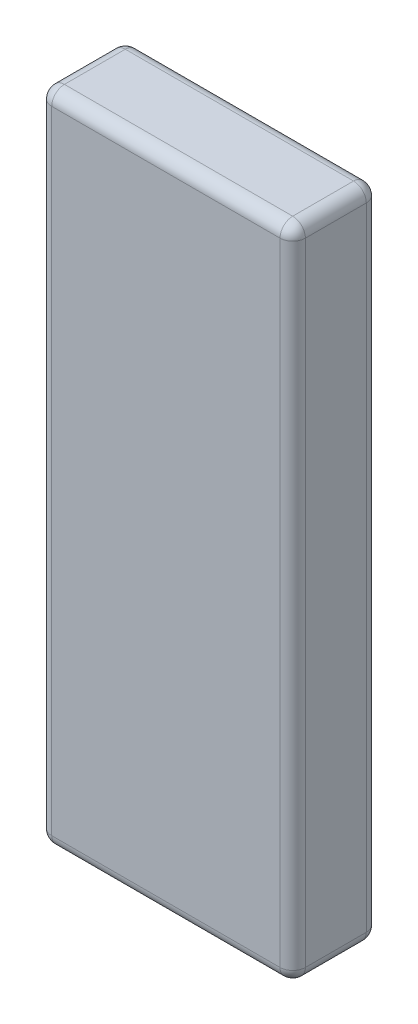
ISO-10303-21;
HEADER;
FILE_DESCRIPTION(('STEP AP214'),'2;1');
FILE_NAME('part.step','',(''),(''),'','','');
FILE_SCHEMA(('AUTOMOTIVE_DESIGN { 1 0 10303 214 1 1 1 1 }'));
ENDSEC;
DATA;
#1=APPLICATION_CONTEXT('core data for automotive mechanical design processes');
#2=APPLICATION_PROTOCOL_DEFINITION('international standard','automotive_design',2000,#1);
#3=PRODUCT_CONTEXT('',#1,'mechanical');
#4=PRODUCT('Part','Part','',(#3));
#5=PRODUCT_RELATED_PRODUCT_CATEGORY('part','',(#4));
#6=PRODUCT_DEFINITION_FORMATION('','',#4);
#7=PRODUCT_DEFINITION_CONTEXT('part definition',#1,'design');
#8=PRODUCT_DEFINITION('design','',#6,#7);
#9=PRODUCT_DEFINITION_SHAPE('','',#8);
#10=(LENGTH_UNIT() NAMED_UNIT(*) SI_UNIT(.MILLI.,.METRE.));
#11=(NAMED_UNIT(*) PLANE_ANGLE_UNIT() SI_UNIT($,.RADIAN.));
#12=(NAMED_UNIT(*) SI_UNIT($,.STERADIAN.) SOLID_ANGLE_UNIT());
#13=UNCERTAINTY_MEASURE_WITH_UNIT(LENGTH_MEASURE(1.E-05),#10,'distance_accuracy_value','');
#14=(GEOMETRIC_REPRESENTATION_CONTEXT(3) GLOBAL_UNCERTAINTY_ASSIGNED_CONTEXT((#13)) GLOBAL_UNIT_ASSIGNED_CONTEXT((#10,
#11,#12)) REPRESENTATION_CONTEXT('',''));
#15=CARTESIAN_POINT('',(0.,0.,0.));
#16=DIRECTION('',(0.,0.,1.));
#17=DIRECTION('',(1.,0.,0.));
#18=AXIS2_PLACEMENT_3D('',#15,#16,#17);
#19=CARTESIAN_POINT('',(0.,0.,6.8));
#20=DIRECTION('',(1.,0.,0.));
#21=DIRECTION('',(0.,0.,-1.));
#22=AXIS2_PLACEMENT_3D('',#19,#20,#21);
#23=PLANE('',#22);
#24=DIRECTION('',(0.,0.,-1.));
#25=VECTOR('',#24,1.);
#26=CARTESIAN_POINT('',(0.,50.8,6.8));
#27=LINE('',#26,#25);
#28=CARTESIAN_POINT('',(0.,50.8,5.8));
#29=VERTEX_POINT('',#28);
#30=CARTESIAN_POINT('',(0.,50.8,1.));
#31=VERTEX_POINT('',#30);
#32=EDGE_CURVE('E187',#29,#31,#27,.T.);
#33=ORIENTED_EDGE('',*,*,#32,.T.);
#34=DIRECTION('',(0.,-1.,0.));
#35=VECTOR('',#34,1.);
#36=CARTESIAN_POINT('',(0.,0.,1.));
#37=LINE('',#36,#35);
#38=CARTESIAN_POINT('',(0.,1.,1.));
#39=VERTEX_POINT('',#38);
#40=EDGE_CURVE('E194',#31,#39,#37,.T.);
#41=ORIENTED_EDGE('',*,*,#40,.T.);
#42=DIRECTION('',(0.,0.,-1.));
#43=VECTOR('',#42,1.);
#44=CARTESIAN_POINT('',(0.,1.,6.8));
#45=LINE('',#44,#43);
#46=CARTESIAN_POINT('',(0.,1.,5.8));
#47=VERTEX_POINT('',#46);
#48=EDGE_CURVE('E190',#39,#47,#45,.F.);
#49=ORIENTED_EDGE('',*,*,#48,.T.);
#50=DIRECTION('',(0.,-1.,0.));
#51=VECTOR('',#50,1.);
#52=CARTESIAN_POINT('',(0.,0.,5.8));
#53=LINE('',#52,#51);
#54=EDGE_CURVE('E184',#47,#29,#53,.F.);
#55=ORIENTED_EDGE('',*,*,#54,.T.);
#56=EDGE_LOOP('',(#33,#41,#49,#55));
#57=FACE_BOUND('',#56,.T.);
#58=ADVANCED_FACE('F45',(#57),#23,.F.);
#59=CARTESIAN_POINT('',(0.,0.,6.8));
#60=DIRECTION('',(0.,1.,0.));
#61=DIRECTION('',(0.,0.,1.));
#62=AXIS2_PLACEMENT_3D('',#59,#60,#61);
#63=PLANE('',#62);
#64=DIRECTION('',(0.,0.,-1.));
#65=VECTOR('',#64,1.);
#66=CARTESIAN_POINT('',(1.,0.,6.8));
#67=LINE('',#66,#65);
#68=CARTESIAN_POINT('',(1.,0.,5.8));
#69=VERTEX_POINT('',#68);
#70=CARTESIAN_POINT('',(1.,0.,1.));
#71=VERTEX_POINT('',#70);
#72=EDGE_CURVE('E146',#69,#71,#67,.T.);
#73=ORIENTED_EDGE('',*,*,#72,.T.);
#74=DIRECTION('',(1.,0.,0.));
#75=VECTOR('',#74,1.);
#76=CARTESIAN_POINT('',(20.,0.,1.));
#77=LINE('',#76,#75);
#78=CARTESIAN_POINT('',(19.,0.,1.));
#79=VERTEX_POINT('',#78);
#80=EDGE_CURVE('E141',#71,#79,#77,.T.);
#81=ORIENTED_EDGE('',*,*,#80,.T.);
#82=DIRECTION('',(0.,0.,-1.));
#83=VECTOR('',#82,1.);
#84=CARTESIAN_POINT('',(19.,0.,6.8));
#85=LINE('',#84,#83);
#86=CARTESIAN_POINT('',(19.,0.,5.8));
#87=VERTEX_POINT('',#86);
#88=EDGE_CURVE('E133',#79,#87,#85,.F.);
#89=ORIENTED_EDGE('',*,*,#88,.T.);
#90=DIRECTION('',(1.,0.,0.));
#91=VECTOR('',#90,1.);
#92=CARTESIAN_POINT('',(0.,0.,5.8));
#93=LINE('',#92,#91);
#94=EDGE_CURVE('E138',#87,#69,#93,.F.);
#95=ORIENTED_EDGE('',*,*,#94,.T.);
#96=EDGE_LOOP('',(#73,#81,#89,#95));
#97=FACE_BOUND('',#96,.T.);
#98=ADVANCED_FACE('F136',(#97),#63,.F.);
#99=CARTESIAN_POINT('',(20.,0.,6.8));
#100=DIRECTION('',(-1.,0.,0.));
#101=DIRECTION('',(0.,-1.,0.));
#102=AXIS2_PLACEMENT_3D('',#99,#100,#101);
#103=PLANE('',#102);
#104=DIRECTION('',(0.,0.,-1.));
#105=VECTOR('',#104,1.);
#106=CARTESIAN_POINT('',(20.,1.,6.8));
#107=LINE('',#106,#105);
#108=CARTESIAN_POINT('',(20.,1.,5.8));
#109=VERTEX_POINT('',#108);
#110=CARTESIAN_POINT('',(20.,1.,1.));
#111=VERTEX_POINT('',#110);
#112=EDGE_CURVE('E154',#109,#111,#107,.T.);
#113=ORIENTED_EDGE('',*,*,#112,.T.);
#114=DIRECTION('',(0.,1.,0.));
#115=VECTOR('',#114,1.);
#116=CARTESIAN_POINT('',(20.,51.8,1.));
#117=LINE('',#116,#115);
#118=CARTESIAN_POINT('',(20.,50.8,1.));
#119=VERTEX_POINT('',#118);
#120=EDGE_CURVE('E205',#111,#119,#117,.T.);
#121=ORIENTED_EDGE('',*,*,#120,.T.);
#122=DIRECTION('',(0.,0.,-1.));
#123=VECTOR('',#122,1.);
#124=CARTESIAN_POINT('',(20.,50.8,6.8));
#125=LINE('',#124,#123);
#126=CARTESIAN_POINT('',(20.,50.8,5.8));
#127=VERTEX_POINT('',#126);
#128=EDGE_CURVE('E200',#119,#127,#125,.F.);
#129=ORIENTED_EDGE('',*,*,#128,.T.);
#130=DIRECTION('',(0.,1.,0.));
#131=VECTOR('',#130,1.);
#132=CARTESIAN_POINT('',(20.,0.,5.8));
#133=LINE('',#132,#131);
#134=EDGE_CURVE('E197',#127,#109,#133,.F.);
#135=ORIENTED_EDGE('',*,*,#134,.T.);
#136=EDGE_LOOP('',(#113,#121,#129,#135));
#137=FACE_BOUND('',#136,.T.);
#138=ADVANCED_FACE('F384',(#137),#103,.F.);
#139=CARTESIAN_POINT('',(0.,51.8,6.8));
#140=DIRECTION('',(0.,-1.,0.));
#141=DIRECTION('',(0.,0.,-1.));
#142=AXIS2_PLACEMENT_3D('',#139,#140,#141);
#143=PLANE('',#142);
#144=DIRECTION('',(0.,0.,-1.));
#145=VECTOR('',#144,1.);
#146=CARTESIAN_POINT('',(19.,51.8,6.8));
#147=LINE('',#146,#145);
#148=CARTESIAN_POINT('',(19.,51.8,5.8));
#149=VERTEX_POINT('',#148);
#150=CARTESIAN_POINT('',(19.,51.8,1.));
#151=VERTEX_POINT('',#150);
#152=EDGE_CURVE('E214',#149,#151,#147,.T.);
#153=ORIENTED_EDGE('',*,*,#152,.T.);
#154=DIRECTION('',(-1.,0.,0.));
#155=VECTOR('',#154,1.);
#156=CARTESIAN_POINT('',(0.,51.8,1.));
#157=LINE('',#156,#155);
#158=CARTESIAN_POINT('',(1.,51.8,1.));
#159=VERTEX_POINT('',#158);
#160=EDGE_CURVE('E218',#151,#159,#157,.T.);
#161=ORIENTED_EDGE('',*,*,#160,.T.);
#162=DIRECTION('',(0.,0.,-1.));
#163=VECTOR('',#162,1.);
#164=CARTESIAN_POINT('',(1.,51.8,6.8));
#165=LINE('',#164,#163);
#166=CARTESIAN_POINT('',(1.,51.8,5.8));
#167=VERTEX_POINT('',#166);
#168=EDGE_CURVE('E211',#159,#167,#165,.F.);
#169=ORIENTED_EDGE('',*,*,#168,.T.);
#170=DIRECTION('',(-1.,0.,0.));
#171=VECTOR('',#170,1.);
#172=CARTESIAN_POINT('',(0.,51.8,5.8));
#173=LINE('',#172,#171);
#174=EDGE_CURVE('E208',#167,#149,#173,.F.);
#175=ORIENTED_EDGE('',*,*,#174,.T.);
#176=EDGE_LOOP('',(#153,#161,#169,#175));
#177=FACE_BOUND('',#176,.T.);
#178=ADVANCED_FACE('F333',(#177),#143,.F.);
#179=CARTESIAN_POINT('',(0.,0.,6.8));
#180=DIRECTION('',(0.,0.,-1.));
#181=DIRECTION('',(-1.,0.,0.));
#182=AXIS2_PLACEMENT_3D('',#179,#180,#181);
#183=PLANE('',#182);
#184=DIRECTION('',(0.,1.,0.));
#185=VECTOR('',#184,1.);
#186=CARTESIAN_POINT('',(19.,0.,6.8));
#187=LINE('',#186,#185);
#188=CARTESIAN_POINT('',(19.,1.,6.8));
#189=VERTEX_POINT('',#188);
#190=CARTESIAN_POINT('',(19.,50.8,6.8));
#191=VERTEX_POINT('',#190);
#192=EDGE_CURVE('E55',#189,#191,#187,.T.);
#193=ORIENTED_EDGE('',*,*,#192,.T.);
#194=DIRECTION('',(-1.,0.,0.));
#195=VECTOR('',#194,1.);
#196=CARTESIAN_POINT('',(0.,50.8,6.8));
#197=LINE('',#196,#195);
#198=CARTESIAN_POINT('',(1.,50.8,6.8));
#199=VERTEX_POINT('',#198);
#200=EDGE_CURVE('E11',#191,#199,#197,.T.);
#201=ORIENTED_EDGE('',*,*,#200,.T.);
#202=DIRECTION('',(0.,-1.,0.));
#203=VECTOR('',#202,1.);
#204=CARTESIAN_POINT('',(1.,0.,6.8));
#205=LINE('',#204,#203);
#206=CARTESIAN_POINT('',(1.,1.,6.8));
#207=VERTEX_POINT('',#206);
#208=EDGE_CURVE('E234',#199,#207,#205,.T.);
#209=ORIENTED_EDGE('',*,*,#208,.T.);
#210=DIRECTION('',(1.,0.,0.));
#211=VECTOR('',#210,1.);
#212=CARTESIAN_POINT('',(0.,1.,6.8));
#213=LINE('',#212,#211);
#214=EDGE_CURVE('E66',#207,#189,#213,.T.);
#215=ORIENTED_EDGE('',*,*,#214,.T.);
#216=EDGE_LOOP('',(#193,#201,#209,#215));
#217=FACE_BOUND('',#216,.T.);
#218=ADVANCED_FACE('F348',(#217),#183,.F.);
#219=CARTESIAN_POINT('',(0.,0.,0.));
#220=DIRECTION('',(0.,0.,-1.));
#221=DIRECTION('',(-1.,0.,0.));
#222=AXIS2_PLACEMENT_3D('',#219,#220,#221);
#223=PLANE('',#222);
#224=DIRECTION('',(0.,1.,0.));
#225=VECTOR('',#224,1.);
#226=CARTESIAN_POINT('',(19.,0.,0.));
#227=LINE('',#226,#225);
#228=CARTESIAN_POINT('',(19.,50.8,0.));
#229=VERTEX_POINT('',#228);
#230=CARTESIAN_POINT('',(19.,1.,0.));
#231=VERTEX_POINT('',#230);
#232=EDGE_CURVE('E227',#229,#231,#227,.F.);
#233=ORIENTED_EDGE('',*,*,#232,.T.);
#234=DIRECTION('',(1.,0.,0.));
#235=VECTOR('',#234,1.);
#236=CARTESIAN_POINT('',(0.,1.,0.));
#237=LINE('',#236,#235);
#238=CARTESIAN_POINT('',(1.,1.,0.));
#239=VERTEX_POINT('',#238);
#240=EDGE_CURVE('E230',#231,#239,#237,.F.);
#241=ORIENTED_EDGE('',*,*,#240,.T.);
#242=DIRECTION('',(0.,-1.,0.));
#243=VECTOR('',#242,1.);
#244=CARTESIAN_POINT('',(1.,51.8,0.));
#245=LINE('',#244,#243);
#246=CARTESIAN_POINT('',(1.,50.8,0.));
#247=VERTEX_POINT('',#246);
#248=EDGE_CURVE('E221',#239,#247,#245,.F.);
#249=ORIENTED_EDGE('',*,*,#248,.T.);
#250=DIRECTION('',(-1.,0.,0.));
#251=VECTOR('',#250,1.);
#252=CARTESIAN_POINT('',(20.,50.8,0.));
#253=LINE('',#252,#251);
#254=EDGE_CURVE('E224',#247,#229,#253,.F.);
#255=ORIENTED_EDGE('',*,*,#254,.T.);
#256=EDGE_LOOP('',(#233,#241,#249,#255));
#257=FACE_BOUND('',#256,.T.);
#258=ADVANCED_FACE('F324',(#257),#223,.T.);
#259=CARTESIAN_POINT('',(19.,50.8,6.8));
#260=DIRECTION('',(0.,0.,-1.));
#261=DIRECTION('',(-1.,0.,0.));
#262=AXIS2_PLACEMENT_3D('',#259,#260,#261);
#263=CYLINDRICAL_SURFACE('',#262,1.);
#264=CARTESIAN_POINT('',(19.,50.8,5.8));
#265=DIRECTION('',(0.,0.,1.));
#266=DIRECTION('',(1.,0.,0.));
#267=AXIS2_PLACEMENT_3D('',#264,#265,#266);
#268=CIRCLE('',#267,1.);
#269=EDGE_CURVE('E49',#127,#149,#268,.T.);
#270=ORIENTED_EDGE('',*,*,#269,.F.);
#271=ORIENTED_EDGE('',*,*,#128,.F.);
#272=CARTESIAN_POINT('',(19.,50.8,1.));
#273=DIRECTION('',(0.,0.,-1.));
#274=DIRECTION('',(-1.,0.,0.));
#275=AXIS2_PLACEMENT_3D('',#272,#273,#274);
#276=CIRCLE('',#275,1.);
#277=EDGE_CURVE('E178',#151,#119,#276,.T.);
#278=ORIENTED_EDGE('',*,*,#277,.F.);
#279=ORIENTED_EDGE('',*,*,#152,.F.);
#280=EDGE_LOOP('',(#270,#271,#278,#279));
#281=FACE_BOUND('',#280,.T.);
#282=ADVANCED_FACE('F47',(#281),#263,.T.);
#283=CARTESIAN_POINT('',(19.,50.8,5.8));
#284=DIRECTION('',(0.,1.,0.));
#285=DIRECTION('',(0.,0.,1.));
#286=AXIS2_PLACEMENT_3D('',#283,#284,#285);
#287=SPHERICAL_SURFACE('',#286,1.);
#288=CARTESIAN_POINT('',(19.,50.8,5.8));
#289=DIRECTION('',(0.,1.,0.));
#290=DIRECTION('',(0.,0.,1.));
#291=AXIS2_PLACEMENT_3D('',#288,#289,#290);
#292=CIRCLE('',#291,1.);
#293=EDGE_CURVE('E301',#127,#191,#292,.F.);
#294=ORIENTED_EDGE('',*,*,#293,.F.);
#295=ORIENTED_EDGE('',*,*,#269,.T.);
#296=CARTESIAN_POINT('',(19.,50.8,5.8));
#297=DIRECTION('',(1.,0.,0.));
#298=DIRECTION('',(0.,0.,-1.));
#299=AXIS2_PLACEMENT_3D('',#296,#297,#298);
#300=CIRCLE('',#299,1.);
#301=EDGE_CURVE('E304',#191,#149,#300,.F.);
#302=ORIENTED_EDGE('',*,*,#301,.F.);
#303=EDGE_LOOP('',(#294,#295,#302));
#304=FACE_BOUND('',#303,.T.);
#305=ADVANCED_FACE('F516',(#304),#287,.T.);
#306=CARTESIAN_POINT('',(19.,50.8,1.));
#307=DIRECTION('',(1.,0.,0.));
#308=DIRECTION('',(0.,0.,-1.));
#309=AXIS2_PLACEMENT_3D('',#306,#307,#308);
#310=SPHERICAL_SURFACE('',#309,1.);
#311=CARTESIAN_POINT('',(19.,50.8,1.));
#312=DIRECTION('',(1.,0.,0.));
#313=DIRECTION('',(0.,0.,-1.));
#314=AXIS2_PLACEMENT_3D('',#311,#312,#313);
#315=CIRCLE('',#314,1.);
#316=EDGE_CURVE('E293',#151,#229,#315,.F.);
#317=ORIENTED_EDGE('',*,*,#316,.F.);
#318=ORIENTED_EDGE('',*,*,#277,.T.);
#319=CARTESIAN_POINT('',(19.,50.8,1.));
#320=DIRECTION('',(0.,1.,0.));
#321=DIRECTION('',(0.,0.,1.));
#322=AXIS2_PLACEMENT_3D('',#319,#320,#321);
#323=CIRCLE('',#322,1.);
#324=EDGE_CURVE('E297',#229,#119,#323,.F.);
#325=ORIENTED_EDGE('',*,*,#324,.F.);
#326=EDGE_LOOP('',(#317,#318,#325));
#327=FACE_BOUND('',#326,.T.);
#328=ADVANCED_FACE('F313',(#327),#310,.T.);
#329=CARTESIAN_POINT('',(0.,50.8,5.8));
#330=DIRECTION('',(-1.,0.,0.));
#331=DIRECTION('',(0.,0.,1.));
#332=AXIS2_PLACEMENT_3D('',#329,#330,#331);
#333=CYLINDRICAL_SURFACE('',#332,1.);
#334=ORIENTED_EDGE('',*,*,#301,.T.);
#335=ORIENTED_EDGE('',*,*,#174,.F.);
#336=CARTESIAN_POINT('',(1.,50.8,5.8));
#337=DIRECTION('',(-1.,0.,0.));
#338=DIRECTION('',(0.,0.,1.));
#339=AXIS2_PLACEMENT_3D('',#336,#337,#338);
#340=CIRCLE('',#339,1.);
#341=EDGE_CURVE('E285',#199,#167,#340,.T.);
#342=ORIENTED_EDGE('',*,*,#341,.F.);
#343=ORIENTED_EDGE('',*,*,#200,.F.);
#344=EDGE_LOOP('',(#334,#335,#342,#343));
#345=FACE_BOUND('',#344,.T.);
#346=ADVANCED_FACE('F347',(#345),#333,.T.);
#347=CARTESIAN_POINT('',(19.,0.,5.8));
#348=DIRECTION('',(0.,1.,0.));
#349=DIRECTION('',(-1.,0.,0.));
#350=AXIS2_PLACEMENT_3D('',#347,#348,#349);
#351=CYLINDRICAL_SURFACE('',#350,1.);
#352=ORIENTED_EDGE('',*,*,#293,.T.);
#353=ORIENTED_EDGE('',*,*,#192,.F.);
#354=CARTESIAN_POINT('',(19.,1.,5.8));
#355=DIRECTION('',(0.,-1.,0.));
#356=DIRECTION('',(1.,0.,0.));
#357=AXIS2_PLACEMENT_3D('',#354,#355,#356);
#358=CIRCLE('',#357,1.);
#359=EDGE_CURVE('E159',#109,#189,#358,.T.);
#360=ORIENTED_EDGE('',*,*,#359,.F.);
#361=ORIENTED_EDGE('',*,*,#134,.F.);
#362=EDGE_LOOP('',(#352,#353,#360,#361));
#363=FACE_BOUND('',#362,.T.);
#364=ADVANCED_FACE('F493',(#363),#351,.T.);
#365=CARTESIAN_POINT('',(19.,1.,6.8));
#366=DIRECTION('',(0.,0.,-1.));
#367=DIRECTION('',(-1.,0.,0.));
#368=AXIS2_PLACEMENT_3D('',#365,#366,#367);
#369=CYLINDRICAL_SURFACE('',#368,1.);
#370=CARTESIAN_POINT('',(19.,1.,1.));
#371=DIRECTION('',(0.,0.,-1.));
#372=DIRECTION('',(-1.,0.,0.));
#373=AXIS2_PLACEMENT_3D('',#370,#371,#372);
#374=CIRCLE('',#373,1.);
#375=EDGE_CURVE('E160',#111,#79,#374,.T.);
#376=ORIENTED_EDGE('',*,*,#375,.F.);
#377=ORIENTED_EDGE('',*,*,#112,.F.);
#378=CARTESIAN_POINT('',(19.,1.,5.8));
#379=DIRECTION('',(0.,0.,1.));
#380=DIRECTION('',(1.,0.,0.));
#381=AXIS2_PLACEMENT_3D('',#378,#379,#380);
#382=CIRCLE('',#381,1.);
#383=EDGE_CURVE('E150',#87,#109,#382,.T.);
#384=ORIENTED_EDGE('',*,*,#383,.F.);
#385=ORIENTED_EDGE('',*,*,#88,.F.);
#386=EDGE_LOOP('',(#376,#377,#384,#385));
#387=FACE_BOUND('',#386,.T.);
#388=ADVANCED_FACE('F152',(#387),#369,.T.);
#389=CARTESIAN_POINT('',(19.,0.,1.));
#390=DIRECTION('',(0.,-1.,0.));
#391=DIRECTION('',(1.,0.,0.));
#392=AXIS2_PLACEMENT_3D('',#389,#390,#391);
#393=CYLINDRICAL_SURFACE('',#392,1.);
#394=ORIENTED_EDGE('',*,*,#324,.T.);
#395=ORIENTED_EDGE('',*,*,#120,.F.);
#396=CARTESIAN_POINT('',(19.,1.,1.));
#397=DIRECTION('',(0.,-1.,0.));
#398=DIRECTION('',(1.,0.,0.));
#399=AXIS2_PLACEMENT_3D('',#396,#397,#398);
#400=CIRCLE('',#399,1.);
#401=EDGE_CURVE('E278',#231,#111,#400,.T.);
#402=ORIENTED_EDGE('',*,*,#401,.F.);
#403=ORIENTED_EDGE('',*,*,#232,.F.);
#404=EDGE_LOOP('',(#394,#395,#402,#403));
#405=FACE_BOUND('',#404,.T.);
#406=ADVANCED_FACE('F320',(#405),#393,.T.);
#407=CARTESIAN_POINT('',(0.,50.8,1.));
#408=DIRECTION('',(1.,0.,0.));
#409=DIRECTION('',(0.,0.,-1.));
#410=AXIS2_PLACEMENT_3D('',#407,#408,#409);
#411=CYLINDRICAL_SURFACE('',#410,1.);
#412=ORIENTED_EDGE('',*,*,#316,.T.);
#413=ORIENTED_EDGE('',*,*,#254,.F.);
#414=CARTESIAN_POINT('',(1.,50.8,1.));
#415=DIRECTION('',(-1.,0.,0.));
#416=DIRECTION('',(0.,0.,1.));
#417=AXIS2_PLACEMENT_3D('',#414,#415,#416);
#418=CIRCLE('',#417,1.);
#419=EDGE_CURVE('E274',#159,#247,#418,.T.);
#420=ORIENTED_EDGE('',*,*,#419,.F.);
#421=ORIENTED_EDGE('',*,*,#160,.F.);
#422=EDGE_LOOP('',(#412,#413,#420,#421));
#423=FACE_BOUND('',#422,.T.);
#424=ADVANCED_FACE('F330',(#423),#411,.T.);
#425=CARTESIAN_POINT('',(1.,50.8,6.8));
#426=DIRECTION('',(0.,0.,-1.));
#427=DIRECTION('',(-1.,0.,0.));
#428=AXIS2_PLACEMENT_3D('',#425,#426,#427);
#429=CYLINDRICAL_SURFACE('',#428,1.);
#430=CARTESIAN_POINT('',(1.,50.8,5.8));
#431=DIRECTION('',(0.,0.,1.));
#432=DIRECTION('',(1.,0.,0.));
#433=AXIS2_PLACEMENT_3D('',#430,#431,#432);
#434=CIRCLE('',#433,1.);
#435=EDGE_CURVE('E289',#167,#29,#434,.T.);
#436=ORIENTED_EDGE('',*,*,#435,.F.);
#437=ORIENTED_EDGE('',*,*,#168,.F.);
#438=CARTESIAN_POINT('',(1.,50.8,1.));
#439=DIRECTION('',(0.,0.,-1.));
#440=DIRECTION('',(-1.,0.,0.));
#441=AXIS2_PLACEMENT_3D('',#438,#439,#440);
#442=CIRCLE('',#441,1.);
#443=EDGE_CURVE('E270',#31,#159,#442,.T.);
#444=ORIENTED_EDGE('',*,*,#443,.F.);
#445=ORIENTED_EDGE('',*,*,#32,.F.);
#446=EDGE_LOOP('',(#436,#437,#444,#445));
#447=FACE_BOUND('',#446,.T.);
#448=ADVANCED_FACE('F338',(#447),#429,.T.);
#449=CARTESIAN_POINT('',(1.,50.8,5.8));
#450=DIRECTION('',(0.,1.,0.));
#451=DIRECTION('',(0.,0.,1.));
#452=AXIS2_PLACEMENT_3D('',#449,#450,#451);
#453=SPHERICAL_SURFACE('',#452,1.);
#454=ORIENTED_EDGE('',*,*,#341,.T.);
#455=ORIENTED_EDGE('',*,*,#435,.T.);
#456=CARTESIAN_POINT('',(1.,50.8,5.8));
#457=DIRECTION('',(0.,1.,0.));
#458=DIRECTION('',(0.,0.,1.));
#459=AXIS2_PLACEMENT_3D('',#456,#457,#458);
#460=CIRCLE('',#459,1.);
#461=EDGE_CURVE('E167',#199,#29,#460,.F.);
#462=ORIENTED_EDGE('',*,*,#461,.F.);
#463=EDGE_LOOP('',(#454,#455,#462));
#464=FACE_BOUND('',#463,.T.);
#465=ADVANCED_FACE('F344',(#464),#453,.T.);
#466=CARTESIAN_POINT('',(19.,1.,5.8));
#467=DIRECTION('',(1.,0.,0.));
#468=DIRECTION('',(0.,1.,0.));
#469=AXIS2_PLACEMENT_3D('',#466,#467,#468);
#470=SPHERICAL_SURFACE('',#469,1.);
#471=ORIENTED_EDGE('',*,*,#383,.T.);
#472=ORIENTED_EDGE('',*,*,#359,.T.);
#473=CARTESIAN_POINT('',(19.,1.,5.8));
#474=DIRECTION('',(1.,0.,0.));
#475=DIRECTION('',(0.,0.,-1.));
#476=AXIS2_PLACEMENT_3D('',#473,#474,#475);
#477=CIRCLE('',#476,1.);
#478=EDGE_CURVE('E163',#87,#189,#477,.F.);
#479=ORIENTED_EDGE('',*,*,#478,.F.);
#480=EDGE_LOOP('',(#471,#472,#479));
#481=FACE_BOUND('',#480,.T.);
#482=ADVANCED_FACE('F164',(#481),#470,.T.);
#483=CARTESIAN_POINT('',(19.,1.,1.));
#484=DIRECTION('',(1.,0.,0.));
#485=DIRECTION('',(0.,1.,0.));
#486=AXIS2_PLACEMENT_3D('',#483,#484,#485);
#487=SPHERICAL_SURFACE('',#486,1.);
#488=ORIENTED_EDGE('',*,*,#401,.T.);
#489=ORIENTED_EDGE('',*,*,#375,.T.);
#490=CARTESIAN_POINT('',(19.,1.,1.));
#491=DIRECTION('',(1.,0.,0.));
#492=DIRECTION('',(0.,0.,-1.));
#493=AXIS2_PLACEMENT_3D('',#490,#491,#492);
#494=CIRCLE('',#493,1.);
#495=EDGE_CURVE('E168',#231,#79,#494,.F.);
#496=ORIENTED_EDGE('',*,*,#495,.F.);
#497=EDGE_LOOP('',(#488,#489,#496));
#498=FACE_BOUND('',#497,.T.);
#499=ADVANCED_FACE('F367',(#498),#487,.T.);
#500=CARTESIAN_POINT('',(1.,50.8,1.));
#501=DIRECTION('',(0.,1.,0.));
#502=DIRECTION('',(0.,0.,1.));
#503=AXIS2_PLACEMENT_3D('',#500,#501,#502);
#504=SPHERICAL_SURFACE('',#503,1.);
#505=ORIENTED_EDGE('',*,*,#443,.T.);
#506=ORIENTED_EDGE('',*,*,#419,.T.);
#507=CARTESIAN_POINT('',(1.,50.8,1.));
#508=DIRECTION('',(0.,1.,0.));
#509=DIRECTION('',(0.,0.,1.));
#510=AXIS2_PLACEMENT_3D('',#507,#508,#509);
#511=CIRCLE('',#510,1.);
#512=EDGE_CURVE('E260',#31,#247,#511,.F.);
#513=ORIENTED_EDGE('',*,*,#512,.F.);
#514=EDGE_LOOP('',(#505,#506,#513));
#515=FACE_BOUND('',#514,.T.);
#516=ADVANCED_FACE('F369',(#515),#504,.T.);
#517=CARTESIAN_POINT('',(1.,0.,5.8));
#518=DIRECTION('',(0.,-1.,0.));
#519=DIRECTION('',(0.,0.,-1.));
#520=AXIS2_PLACEMENT_3D('',#517,#518,#519);
#521=CYLINDRICAL_SURFACE('',#520,1.);
#522=ORIENTED_EDGE('',*,*,#461,.T.);
#523=ORIENTED_EDGE('',*,*,#54,.F.);
#524=CARTESIAN_POINT('',(1.,1.,5.8));
#525=DIRECTION('',(0.,-1.,0.));
#526=DIRECTION('',(0.,0.,-1.));
#527=AXIS2_PLACEMENT_3D('',#524,#525,#526);
#528=CIRCLE('',#527,1.);
#529=EDGE_CURVE('E256',#207,#47,#528,.T.);
#530=ORIENTED_EDGE('',*,*,#529,.F.);
#531=ORIENTED_EDGE('',*,*,#208,.F.);
#532=EDGE_LOOP('',(#522,#523,#530,#531));
#533=FACE_BOUND('',#532,.T.);
#534=ADVANCED_FACE('F352',(#533),#521,.T.);
#535=CARTESIAN_POINT('',(0.,1.,5.8));
#536=DIRECTION('',(1.,0.,0.));
#537=DIRECTION('',(0.,0.,-1.));
#538=AXIS2_PLACEMENT_3D('',#535,#536,#537);
#539=CYLINDRICAL_SURFACE('',#538,1.);
#540=ORIENTED_EDGE('',*,*,#478,.T.);
#541=ORIENTED_EDGE('',*,*,#214,.F.);
#542=CARTESIAN_POINT('',(1.,1.,5.8));
#543=DIRECTION('',(-1.,0.,0.));
#544=DIRECTION('',(0.,0.,1.));
#545=AXIS2_PLACEMENT_3D('',#542,#543,#544);
#546=CIRCLE('',#545,1.);
#547=EDGE_CURVE('E172',#69,#207,#546,.T.);
#548=ORIENTED_EDGE('',*,*,#547,.F.);
#549=ORIENTED_EDGE('',*,*,#94,.F.);
#550=EDGE_LOOP('',(#540,#541,#548,#549));
#551=FACE_BOUND('',#550,.T.);
#552=ADVANCED_FACE('F170',(#551),#539,.T.);
#553=CARTESIAN_POINT('',(0.,1.,1.));
#554=DIRECTION('',(-1.,0.,0.));
#555=DIRECTION('',(0.,0.,1.));
#556=AXIS2_PLACEMENT_3D('',#553,#554,#555);
#557=CYLINDRICAL_SURFACE('',#556,1.);
#558=ORIENTED_EDGE('',*,*,#495,.T.);
#559=ORIENTED_EDGE('',*,*,#80,.F.);
#560=CARTESIAN_POINT('',(1.,1.,1.));
#561=DIRECTION('',(-1.,0.,0.));
#562=DIRECTION('',(0.,0.,1.));
#563=AXIS2_PLACEMENT_3D('',#560,#561,#562);
#564=CIRCLE('',#563,1.);
#565=EDGE_CURVE('E250',#239,#71,#564,.T.);
#566=ORIENTED_EDGE('',*,*,#565,.F.);
#567=ORIENTED_EDGE('',*,*,#240,.F.);
#568=EDGE_LOOP('',(#558,#559,#566,#567));
#569=FACE_BOUND('',#568,.T.);
#570=ADVANCED_FACE('F365',(#569),#557,.T.);
#571=CARTESIAN_POINT('',(1.,0.,1.));
#572=DIRECTION('',(0.,1.,0.));
#573=DIRECTION('',(0.,0.,1.));
#574=AXIS2_PLACEMENT_3D('',#571,#572,#573);
#575=CYLINDRICAL_SURFACE('',#574,1.);
#576=ORIENTED_EDGE('',*,*,#512,.T.);
#577=ORIENTED_EDGE('',*,*,#248,.F.);
#578=CARTESIAN_POINT('',(1.,1.,1.));
#579=DIRECTION('',(0.,-1.,0.));
#580=DIRECTION('',(0.,0.,-1.));
#581=AXIS2_PLACEMENT_3D('',#578,#579,#580);
#582=CIRCLE('',#581,1.);
#583=EDGE_CURVE('E247',#39,#239,#582,.T.);
#584=ORIENTED_EDGE('',*,*,#583,.F.);
#585=ORIENTED_EDGE('',*,*,#40,.F.);
#586=EDGE_LOOP('',(#576,#577,#584,#585));
#587=FACE_BOUND('',#586,.T.);
#588=ADVANCED_FACE('F394',(#587),#575,.T.);
#589=CARTESIAN_POINT('',(1.,1.,5.8));
#590=DIRECTION('',(0.,0.,1.));
#591=DIRECTION('',(1.,0.,0.));
#592=AXIS2_PLACEMENT_3D('',#589,#590,#591);
#593=SPHERICAL_SURFACE('',#592,1.);
#594=ORIENTED_EDGE('',*,*,#547,.T.);
#595=ORIENTED_EDGE('',*,*,#529,.T.);
#596=CARTESIAN_POINT('',(1.,1.,5.8));
#597=DIRECTION('',(0.,0.,1.));
#598=DIRECTION('',(1.,0.,0.));
#599=AXIS2_PLACEMENT_3D('',#596,#597,#598);
#600=CIRCLE('',#599,1.);
#601=EDGE_CURVE('E244',#69,#47,#600,.F.);
#602=ORIENTED_EDGE('',*,*,#601,.F.);
#603=EDGE_LOOP('',(#594,#595,#602));
#604=FACE_BOUND('',#603,.T.);
#605=ADVANCED_FACE('F354',(#604),#593,.T.);
#606=CARTESIAN_POINT('',(1.,1.,1.));
#607=DIRECTION('',(0.,0.,-1.));
#608=DIRECTION('',(-1.,0.,0.));
#609=AXIS2_PLACEMENT_3D('',#606,#607,#608);
#610=SPHERICAL_SURFACE('',#609,1.);
#611=ORIENTED_EDGE('',*,*,#583,.T.);
#612=ORIENTED_EDGE('',*,*,#565,.T.);
#613=CARTESIAN_POINT('',(1.,1.,1.));
#614=DIRECTION('',(0.,0.,-1.));
#615=DIRECTION('',(-1.,0.,0.));
#616=AXIS2_PLACEMENT_3D('',#613,#614,#615);
#617=CIRCLE('',#616,1.);
#618=EDGE_CURVE('E241',#39,#71,#617,.F.);
#619=ORIENTED_EDGE('',*,*,#618,.F.);
#620=EDGE_LOOP('',(#611,#612,#619));
#621=FACE_BOUND('',#620,.T.);
#622=ADVANCED_FACE('F362',(#621),#610,.T.);
#623=CARTESIAN_POINT('',(1.,1.,6.8));
#624=DIRECTION('',(0.,0.,-1.));
#625=DIRECTION('',(-1.,0.,0.));
#626=AXIS2_PLACEMENT_3D('',#623,#624,#625);
#627=CYLINDRICAL_SURFACE('',#626,1.);
#628=ORIENTED_EDGE('',*,*,#601,.T.);
#629=ORIENTED_EDGE('',*,*,#48,.F.);
#630=ORIENTED_EDGE('',*,*,#618,.T.);
#631=ORIENTED_EDGE('',*,*,#72,.F.);
#632=EDGE_LOOP('',(#628,#629,#630,#631));
#633=FACE_BOUND('',#632,.T.);
#634=ADVANCED_FACE('F358',(#633),#627,.T.);
#635=CLOSED_SHELL('',(#58,#98,#138,#178,#218,#258,#282,#305,#328,#346,#364,#388,#406,#424,#448,
#465,#482,#499,#516,#534,#552,#570,#588,#605,#622,#634));
#636=MANIFOLD_SOLID_BREP('B2',#635);
#637=ADVANCED_BREP_SHAPE_REPRESENTATION('',(#18,#636),#14);
#638=SHAPE_DEFINITION_REPRESENTATION(#9,#637);
ENDSEC;
END-ISO-10303-21;
